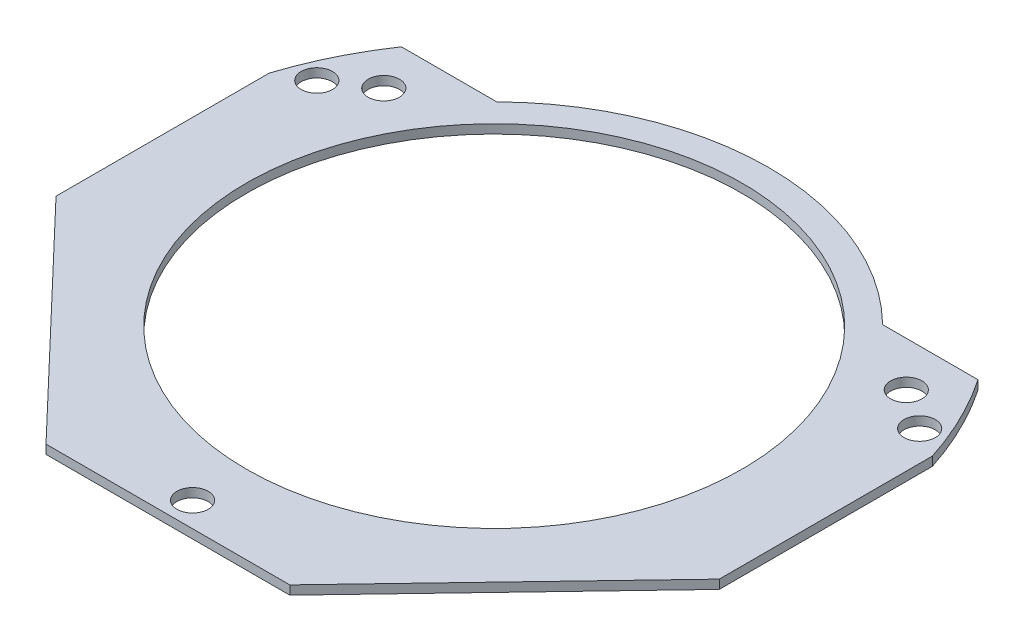
ISO-10303-21;
HEADER;
FILE_DESCRIPTION(('STEP AP214'),'2;1');
FILE_NAME('part.step','',(''),(''),'','','');
FILE_SCHEMA(('AUTOMOTIVE_DESIGN { 1 0 10303 214 1 1 1 1 }'));
ENDSEC;
DATA;
#1=APPLICATION_CONTEXT('core data for automotive mechanical design processes');
#2=APPLICATION_PROTOCOL_DEFINITION('international standard','automotive_design',2000,#1);
#3=PRODUCT_CONTEXT('',#1,'mechanical');
#4=PRODUCT('Part','Part','',(#3));
#5=PRODUCT_RELATED_PRODUCT_CATEGORY('part','',(#4));
#6=PRODUCT_DEFINITION_FORMATION('','',#4);
#7=PRODUCT_DEFINITION_CONTEXT('part definition',#1,'design');
#8=PRODUCT_DEFINITION('design','',#6,#7);
#9=PRODUCT_DEFINITION_SHAPE('','',#8);
#10=(LENGTH_UNIT() NAMED_UNIT(*) SI_UNIT(.MILLI.,.METRE.));
#11=(NAMED_UNIT(*) PLANE_ANGLE_UNIT() SI_UNIT($,.RADIAN.));
#12=(NAMED_UNIT(*) SI_UNIT($,.STERADIAN.) SOLID_ANGLE_UNIT());
#13=UNCERTAINTY_MEASURE_WITH_UNIT(LENGTH_MEASURE(1.E-05),#10,'distance_accuracy_value','');
#14=(GEOMETRIC_REPRESENTATION_CONTEXT(3) GLOBAL_UNCERTAINTY_ASSIGNED_CONTEXT((#13)) GLOBAL_UNIT_ASSIGNED_CONTEXT((#10,
#11,#12)) REPRESENTATION_CONTEXT('',''));
#15=CARTESIAN_POINT('',(0.,0.,0.));
#16=DIRECTION('',(0.,0.,1.));
#17=DIRECTION('',(1.,0.,0.));
#18=AXIS2_PLACEMENT_3D('',#15,#16,#17);
#19=CARTESIAN_POINT('',(0.,1.,0.));
#20=DIRECTION('',(0.,-1.,0.));
#21=DIRECTION('',(0.,0.,-1.));
#22=AXIS2_PLACEMENT_3D('',#19,#20,#21);
#23=CYLINDRICAL_SURFACE('',#22,39.);
#24=CARTESIAN_POINT('',(0.,1.,0.));
#25=DIRECTION('',(0.,1.,0.));
#26=DIRECTION('',(0.,0.,1.));
#27=AXIS2_PLACEMENT_3D('',#24,#25,#26);
#28=CIRCLE('',#27,39.);
#29=CARTESIAN_POINT('',(37.1302295401054,1.,-11.9308865680252));
#30=VERTEX_POINT('',#29);
#31=CARTESIAN_POINT('',(32.2790573942616,1.,-21.8874953737965));
#32=VERTEX_POINT('',#31);
#33=EDGE_CURVE('E221',#30,#32,#28,.T.);
#34=ORIENTED_EDGE('',*,*,#33,.F.);
#35=DIRECTION('',(0.,-1.,0.));
#36=VECTOR('',#35,1.);
#37=CARTESIAN_POINT('',(37.1302295401054,1.,-11.9308865680252));
#38=LINE('',#37,#36);
#39=CARTESIAN_POINT('',(37.1302295401054,0.,-11.9308865680252));
#40=VERTEX_POINT('',#39);
#41=EDGE_CURVE('E151',#30,#40,#38,.T.);
#42=ORIENTED_EDGE('',*,*,#41,.T.);
#43=CARTESIAN_POINT('',(0.,0.,0.));
#44=DIRECTION('',(0.,1.,0.));
#45=DIRECTION('',(0.,0.,1.));
#46=AXIS2_PLACEMENT_3D('',#43,#44,#45);
#47=CIRCLE('',#46,39.);
#48=CARTESIAN_POINT('',(32.2790573942616,0.,-21.8874953737965));
#49=VERTEX_POINT('',#48);
#50=EDGE_CURVE('E215',#40,#49,#47,.T.);
#51=ORIENTED_EDGE('',*,*,#50,.T.);
#52=DIRECTION('',(0.,-1.,0.));
#53=VECTOR('',#52,1.);
#54=CARTESIAN_POINT('',(32.2790573942616,1.,-21.8874953737965));
#55=LINE('',#54,#53);
#56=EDGE_CURVE('E178',#49,#32,#55,.F.);
#57=ORIENTED_EDGE('',*,*,#56,.T.);
#58=EDGE_LOOP('',(#34,#42,#51,#57));
#59=FACE_BOUND('',#58,.T.);
#60=ADVANCED_FACE('F35',(#59),#23,.T.);
#61=CARTESIAN_POINT('',(-32.2790573942616,0.,-21.8874953737965));
#62=VERTEX_POINT('',#61);
#63=CARTESIAN_POINT('',(-37.1302295401054,0.,-11.9308865680252));
#64=VERTEX_POINT('',#63);
#65=EDGE_CURVE('E222',#62,#64,#47,.T.);
#66=ORIENTED_EDGE('',*,*,#65,.T.);
#67=DIRECTION('',(0.,-1.,0.));
#68=VECTOR('',#67,1.);
#69=CARTESIAN_POINT('',(-37.1302295401054,1.,-11.9308865680252));
#70=LINE('',#69,#68);
#71=CARTESIAN_POINT('',(-37.1302295401054,1.,-11.9308865680252));
#72=VERTEX_POINT('',#71);
#73=EDGE_CURVE('E156',#64,#72,#70,.F.);
#74=ORIENTED_EDGE('',*,*,#73,.T.);
#75=CARTESIAN_POINT('',(-32.2790573942616,1.,-21.8874953737965));
#76=VERTEX_POINT('',#75);
#77=EDGE_CURVE('E218',#76,#72,#28,.T.);
#78=ORIENTED_EDGE('',*,*,#77,.F.);
#79=DIRECTION('',(0.,-1.,0.));
#80=VECTOR('',#79,1.);
#81=CARTESIAN_POINT('',(-32.2790573942616,1.,-21.8874953737965));
#82=LINE('',#81,#80);
#83=EDGE_CURVE('E174',#76,#62,#82,.T.);
#84=ORIENTED_EDGE('',*,*,#83,.T.);
#85=EDGE_LOOP('',(#66,#74,#78,#84));
#86=FACE_BOUND('',#85,.T.);
#87=ADVANCED_FACE('F37',(#86),#23,.T.);
#88=CARTESIAN_POINT('',(0.,1.,0.));
#89=DIRECTION('',(0.,1.,0.));
#90=DIRECTION('',(0.,0.,1.));
#91=AXIS2_PLACEMENT_3D('',#88,#89,#90);
#92=PLANE('',#91);
#93=DIRECTION('',(0.,0.,-1.));
#94=VECTOR('',#93,1.);
#95=CARTESIAN_POINT('',(-37.1302295401054,1.,11.9308865680252));
#96=LINE('',#95,#94);
#97=CARTESIAN_POINT('',(-37.1302295401054,1.,11.9308865680252));
#98=VERTEX_POINT('',#97);
#99=EDGE_CURVE('E133',#98,#72,#96,.T.);
#100=ORIENTED_EDGE('',*,*,#99,.F.);
#101=DIRECTION('',(-0.690409675030763,0.,-0.723418606771982));
#102=VECTOR('',#101,1.);
#103=CARTESIAN_POINT('',(-13.650716041934,1.,36.532970746197));
#104=LINE('',#103,#102);
#105=CARTESIAN_POINT('',(-13.650716041934,1.,36.532970746197));
#106=VERTEX_POINT('',#105);
#107=EDGE_CURVE('E135',#106,#98,#104,.T.);
#108=ORIENTED_EDGE('',*,*,#107,.F.);
#109=DIRECTION('',(-1.,0.,0.));
#110=VECTOR('',#109,1.);
#111=CARTESIAN_POINT('',(13.650716041934,1.,36.532970746197));
#112=LINE('',#111,#110);
#113=CARTESIAN_POINT('',(13.650716041934,1.,36.532970746197));
#114=VERTEX_POINT('',#113);
#115=EDGE_CURVE('E145',#114,#106,#112,.T.);
#116=ORIENTED_EDGE('',*,*,#115,.F.);
#117=DIRECTION('',(-0.690409675030763,0.,0.723418606771982));
#118=VECTOR('',#117,1.);
#119=CARTESIAN_POINT('',(37.1302295401054,1.,11.9308865680252));
#120=LINE('',#119,#118);
#121=CARTESIAN_POINT('',(37.1302295401054,1.,11.9308865680252));
#122=VERTEX_POINT('',#121);
#123=EDGE_CURVE('E116',#122,#114,#120,.T.);
#124=ORIENTED_EDGE('',*,*,#123,.F.);
#125=DIRECTION('',(0.,0.,1.));
#126=VECTOR('',#125,1.);
#127=CARTESIAN_POINT('',(37.1302295401054,1.,-19.9611219644377));
#128=LINE('',#127,#126);
#129=EDGE_CURVE('E142',#30,#122,#128,.T.);
#130=ORIENTED_EDGE('',*,*,#129,.F.);
#131=ORIENTED_EDGE('',*,*,#33,.T.);
#132=DIRECTION('',(1.,0.,0.));
#133=VECTOR('',#132,1.);
#134=CARTESIAN_POINT('',(21.5986121374045,1.,-21.8874953737965));
#135=LINE('',#134,#133);
#136=CARTESIAN_POINT('',(21.5986121374045,1.,-21.8874953737965));
#137=VERTEX_POINT('',#136);
#138=EDGE_CURVE('E162',#137,#32,#135,.T.);
#139=ORIENTED_EDGE('',*,*,#138,.F.);
#140=CARTESIAN_POINT('',(0.,1.,0.));
#141=DIRECTION('',(0.,-1.,0.));
#142=DIRECTION('',(0.,0.,1.));
#143=AXIS2_PLACEMENT_3D('',#140,#141,#142);
#144=CIRCLE('',#143,30.75);
#145=CARTESIAN_POINT('',(-21.5986121374045,1.,-21.8874953737965));
#146=VERTEX_POINT('',#145);
#147=EDGE_CURVE('E167',#146,#137,#144,.T.);
#148=ORIENTED_EDGE('',*,*,#147,.F.);
#149=DIRECTION('',(1.,0.,0.));
#150=VECTOR('',#149,1.);
#151=CARTESIAN_POINT('',(-41.1652741562572,1.,-21.8874953737965));
#152=LINE('',#151,#150);
#153=EDGE_CURVE('E159',#76,#146,#152,.T.);
#154=ORIENTED_EDGE('',*,*,#153,.F.);
#155=ORIENTED_EDGE('',*,*,#77,.T.);
#156=EDGE_LOOP('',(#100,#108,#116,#124,#130,#131,#139,#148,#154,#155));
#157=FACE_BOUND('',#156,.T.);
#158=CARTESIAN_POINT('',(-33.7500000000001,1.,-13.8874953737965));
#159=DIRECTION('',(0.,1.,0.));
#160=DIRECTION('',(0.,0.,-1.));
#161=AXIS2_PLACEMENT_3D('',#158,#159,#160);
#162=CIRCLE('',#161,1.75);
#163=CARTESIAN_POINT('',(-33.7500000000001,1.,-15.6374953737965));
#164=VERTEX_POINT('',#163);
#165=EDGE_CURVE('E181',#164,#164,#162,.T.);
#166=ORIENTED_EDGE('',*,*,#165,.F.);
#167=EDGE_LOOP('',(#166));
#168=FACE_BOUND('',#167,.T.);
#169=CARTESIAN_POINT('',(33.7500000000001,1.,-13.8874953737965));
#170=DIRECTION('',(0.,1.,0.));
#171=DIRECTION('',(0.,0.,1.));
#172=AXIS2_PLACEMENT_3D('',#169,#170,#171);
#173=CIRCLE('',#172,1.75);
#174=CARTESIAN_POINT('',(33.7500000000001,1.,-12.1374953737965));
#175=VERTEX_POINT('',#174);
#176=EDGE_CURVE('E185',#175,#175,#173,.T.);
#177=ORIENTED_EDGE('',*,*,#176,.F.);
#178=EDGE_LOOP('',(#177));
#179=FACE_BOUND('',#178,.T.);
#180=CARTESIAN_POINT('',(0.,1.,0.));
#181=DIRECTION('',(0.,1.,0.));
#182=DIRECTION('',(0.,0.,1.));
#183=AXIS2_PLACEMENT_3D('',#180,#181,#182);
#184=CIRCLE('',#183,27.75);
#185=CARTESIAN_POINT('',(0.,1.,27.75));
#186=VERTEX_POINT('',#185);
#187=EDGE_CURVE('E191',#186,#186,#184,.T.);
#188=ORIENTED_EDGE('',*,*,#187,.F.);
#189=EDGE_LOOP('',(#188));
#190=FACE_BOUND('',#189,.T.);
#191=CARTESIAN_POINT('',(0.,1.,33.7749907475931));
#192=DIRECTION('',(0.,1.,0.));
#193=DIRECTION('',(0.,0.,1.));
#194=AXIS2_PLACEMENT_3D('',#191,#192,#193);
#195=CIRCLE('',#194,1.75);
#196=CARTESIAN_POINT('',(0.,1.,35.5249907475931));
#197=VERTEX_POINT('',#196);
#198=EDGE_CURVE('E197',#197,#197,#195,.T.);
#199=ORIENTED_EDGE('',*,*,#198,.F.);
#200=EDGE_LOOP('',(#199));
#201=FACE_BOUND('',#200,.T.);
#202=CARTESIAN_POINT('',(-29.2499999999999,1.,-16.8874953737967));
#203=DIRECTION('',(0.,1.,0.));
#204=DIRECTION('',(0.,0.,1.));
#205=AXIS2_PLACEMENT_3D('',#202,#203,#204);
#206=CIRCLE('',#205,1.75);
#207=CARTESIAN_POINT('',(-29.2499999999999,1.,-15.1374953737967));
#208=VERTEX_POINT('',#207);
#209=EDGE_CURVE('E203',#208,#208,#206,.T.);
#210=ORIENTED_EDGE('',*,*,#209,.F.);
#211=EDGE_LOOP('',(#210));
#212=FACE_BOUND('',#211,.T.);
#213=CARTESIAN_POINT('',(29.2500000000001,1.,-16.8874953737965));
#214=DIRECTION('',(0.,1.,0.));
#215=DIRECTION('',(0.,0.,1.));
#216=AXIS2_PLACEMENT_3D('',#213,#214,#215);
#217=CIRCLE('',#216,1.75);
#218=CARTESIAN_POINT('',(29.2500000000001,1.,-15.1374953737965));
#219=VERTEX_POINT('',#218);
#220=EDGE_CURVE('E209',#219,#219,#217,.T.);
#221=ORIENTED_EDGE('',*,*,#220,.F.);
#222=EDGE_LOOP('',(#221));
#223=FACE_BOUND('',#222,.T.);
#224=ADVANCED_FACE('F233',(#157,#168,#179,#190,#201,#212,#223),#92,.T.);
#225=CARTESIAN_POINT('',(0.,0.,0.));
#226=DIRECTION('',(0.,1.,0.));
#227=DIRECTION('',(0.,0.,1.));
#228=AXIS2_PLACEMENT_3D('',#225,#226,#227);
#229=PLANE('',#228);
#230=CARTESIAN_POINT('',(-33.7500000000001,0.,-13.8874953737965));
#231=DIRECTION('',(0.,1.,0.));
#232=DIRECTION('',(0.,0.,-1.));
#233=AXIS2_PLACEMENT_3D('',#230,#231,#232);
#234=CIRCLE('',#233,1.75);
#235=CARTESIAN_POINT('',(-33.7500000000001,0.,-15.6374953737965));
#236=VERTEX_POINT('',#235);
#237=EDGE_CURVE('E182',#236,#236,#234,.T.);
#238=ORIENTED_EDGE('',*,*,#237,.T.);
#239=EDGE_LOOP('',(#238));
#240=FACE_BOUND('',#239,.T.);
#241=CARTESIAN_POINT('',(33.7500000000001,0.,-13.8874953737965));
#242=DIRECTION('',(0.,1.,0.));
#243=DIRECTION('',(0.,0.,1.));
#244=AXIS2_PLACEMENT_3D('',#241,#242,#243);
#245=CIRCLE('',#244,1.75);
#246=CARTESIAN_POINT('',(33.7500000000001,0.,-12.1374953737965));
#247=VERTEX_POINT('',#246);
#248=EDGE_CURVE('E188',#247,#247,#245,.T.);
#249=ORIENTED_EDGE('',*,*,#248,.T.);
#250=EDGE_LOOP('',(#249));
#251=FACE_BOUND('',#250,.T.);
#252=CARTESIAN_POINT('',(0.,0.,0.));
#253=DIRECTION('',(0.,1.,0.));
#254=DIRECTION('',(0.,0.,1.));
#255=AXIS2_PLACEMENT_3D('',#252,#253,#254);
#256=CIRCLE('',#255,27.75);
#257=CARTESIAN_POINT('',(0.,0.,27.75));
#258=VERTEX_POINT('',#257);
#259=EDGE_CURVE('E194',#258,#258,#256,.T.);
#260=ORIENTED_EDGE('',*,*,#259,.T.);
#261=EDGE_LOOP('',(#260));
#262=FACE_BOUND('',#261,.T.);
#263=CARTESIAN_POINT('',(0.,0.,33.7749907475931));
#264=DIRECTION('',(0.,1.,0.));
#265=DIRECTION('',(0.,0.,1.));
#266=AXIS2_PLACEMENT_3D('',#263,#264,#265);
#267=CIRCLE('',#266,1.75);
#268=CARTESIAN_POINT('',(0.,0.,35.5249907475931));
#269=VERTEX_POINT('',#268);
#270=EDGE_CURVE('E200',#269,#269,#267,.T.);
#271=ORIENTED_EDGE('',*,*,#270,.T.);
#272=EDGE_LOOP('',(#271));
#273=FACE_BOUND('',#272,.T.);
#274=CARTESIAN_POINT('',(-29.2499999999999,0.,-16.8874953737967));
#275=DIRECTION('',(0.,1.,0.));
#276=DIRECTION('',(0.,0.,1.));
#277=AXIS2_PLACEMENT_3D('',#274,#275,#276);
#278=CIRCLE('',#277,1.75);
#279=CARTESIAN_POINT('',(-29.2499999999999,0.,-15.1374953737967));
#280=VERTEX_POINT('',#279);
#281=EDGE_CURVE('E206',#280,#280,#278,.T.);
#282=ORIENTED_EDGE('',*,*,#281,.T.);
#283=EDGE_LOOP('',(#282));
#284=FACE_BOUND('',#283,.T.);
#285=CARTESIAN_POINT('',(29.2500000000001,0.,-16.8874953737965));
#286=DIRECTION('',(0.,1.,0.));
#287=DIRECTION('',(0.,0.,1.));
#288=AXIS2_PLACEMENT_3D('',#285,#286,#287);
#289=CIRCLE('',#288,1.75);
#290=CARTESIAN_POINT('',(29.2500000000001,0.,-15.1374953737965));
#291=VERTEX_POINT('',#290);
#292=EDGE_CURVE('E212',#291,#291,#289,.T.);
#293=ORIENTED_EDGE('',*,*,#292,.T.);
#294=EDGE_LOOP('',(#293));
#295=FACE_BOUND('',#294,.T.);
#296=DIRECTION('',(-0.690409675030763,0.,-0.723418606771982));
#297=VECTOR('',#296,1.);
#298=CARTESIAN_POINT('',(-13.650716041934,0.,36.532970746197));
#299=LINE('',#298,#297);
#300=CARTESIAN_POINT('',(-13.650716041934,0.,36.532970746197));
#301=VERTEX_POINT('',#300);
#302=CARTESIAN_POINT('',(-37.1302295401054,0.,11.9308865680252));
#303=VERTEX_POINT('',#302);
#304=EDGE_CURVE('E129',#301,#303,#299,.T.);
#305=ORIENTED_EDGE('',*,*,#304,.T.);
#306=DIRECTION('',(0.,0.,-1.));
#307=VECTOR('',#306,1.);
#308=CARTESIAN_POINT('',(-37.1302295401054,0.,11.9308865680252));
#309=LINE('',#308,#307);
#310=EDGE_CURVE('E139',#303,#64,#309,.T.);
#311=ORIENTED_EDGE('',*,*,#310,.T.);
#312=ORIENTED_EDGE('',*,*,#65,.F.);
#313=DIRECTION('',(1.,0.,0.));
#314=VECTOR('',#313,1.);
#315=CARTESIAN_POINT('',(0.,0.,-21.8874953737965));
#316=LINE('',#315,#314);
#317=CARTESIAN_POINT('',(-21.5986121374045,0.,-21.8874953737965));
#318=VERTEX_POINT('',#317);
#319=EDGE_CURVE('E43',#62,#318,#316,.T.);
#320=ORIENTED_EDGE('',*,*,#319,.T.);
#321=CARTESIAN_POINT('',(0.,0.,0.));
#322=DIRECTION('',(0.,-1.,0.));
#323=DIRECTION('',(0.,0.,1.));
#324=AXIS2_PLACEMENT_3D('',#321,#322,#323);
#325=CIRCLE('',#324,30.75);
#326=CARTESIAN_POINT('',(21.5986121374045,0.,-21.8874953737965));
#327=VERTEX_POINT('',#326);
#328=EDGE_CURVE('E58',#318,#327,#325,.T.);
#329=ORIENTED_EDGE('',*,*,#328,.T.);
#330=DIRECTION('',(1.,0.,0.));
#331=VECTOR('',#330,1.);
#332=CARTESIAN_POINT('',(21.5986121374045,0.,-21.8874953737965));
#333=LINE('',#332,#331);
#334=EDGE_CURVE('E161',#327,#49,#333,.T.);
#335=ORIENTED_EDGE('',*,*,#334,.T.);
#336=ORIENTED_EDGE('',*,*,#50,.F.);
#337=DIRECTION('',(0.,0.,1.));
#338=VECTOR('',#337,1.);
#339=CARTESIAN_POINT('',(37.1302295401054,0.,0.));
#340=LINE('',#339,#338);
#341=CARTESIAN_POINT('',(37.1302295401054,0.,11.9308865680252));
#342=VERTEX_POINT('',#341);
#343=EDGE_CURVE('E11',#40,#342,#340,.T.);
#344=ORIENTED_EDGE('',*,*,#343,.T.);
#345=DIRECTION('',(-0.690409675030763,0.,0.723418606771982));
#346=VECTOR('',#345,1.);
#347=CARTESIAN_POINT('',(37.1302295401054,0.,11.9308865680252));
#348=LINE('',#347,#346);
#349=CARTESIAN_POINT('',(13.650716041934,0.,36.532970746197));
#350=VERTEX_POINT('',#349);
#351=EDGE_CURVE('E50',#342,#350,#348,.T.);
#352=ORIENTED_EDGE('',*,*,#351,.T.);
#353=DIRECTION('',(-1.,0.,0.));
#354=VECTOR('',#353,1.);
#355=CARTESIAN_POINT('',(13.650716041934,0.,36.532970746197));
#356=LINE('',#355,#354);
#357=EDGE_CURVE('E124',#350,#301,#356,.T.);
#358=ORIENTED_EDGE('',*,*,#357,.T.);
#359=EDGE_LOOP('',(#305,#311,#312,#320,#329,#335,#336,#344,#352,#358));
#360=FACE_BOUND('',#359,.T.);
#361=ADVANCED_FACE('F131',(#240,#251,#262,#273,#284,#295,#360),#229,.F.);
#362=CARTESIAN_POINT('',(29.2500000000001,0.,-16.8874953737965));
#363=DIRECTION('',(0.,1.,0.));
#364=DIRECTION('',(0.,0.,1.));
#365=AXIS2_PLACEMENT_3D('',#362,#363,#364);
#366=CYLINDRICAL_SURFACE('',#365,1.75);
#367=ORIENTED_EDGE('',*,*,#292,.F.);
#368=EDGE_LOOP('',(#367));
#369=FACE_BOUND('',#368,.T.);
#370=ORIENTED_EDGE('',*,*,#220,.T.);
#371=EDGE_LOOP('',(#370));
#372=FACE_BOUND('',#371,.T.);
#373=ADVANCED_FACE('F273',(#369,#372),#366,.F.);
#374=CARTESIAN_POINT('',(-29.2499999999999,0.,-16.8874953737967));
#375=DIRECTION('',(0.,1.,0.));
#376=DIRECTION('',(0.,0.,1.));
#377=AXIS2_PLACEMENT_3D('',#374,#375,#376);
#378=CYLINDRICAL_SURFACE('',#377,1.75);
#379=ORIENTED_EDGE('',*,*,#281,.F.);
#380=EDGE_LOOP('',(#379));
#381=FACE_BOUND('',#380,.T.);
#382=ORIENTED_EDGE('',*,*,#209,.T.);
#383=EDGE_LOOP('',(#382));
#384=FACE_BOUND('',#383,.T.);
#385=ADVANCED_FACE('F278',(#381,#384),#378,.F.);
#386=CARTESIAN_POINT('',(0.,0.,33.7749907475931));
#387=DIRECTION('',(0.,1.,0.));
#388=DIRECTION('',(0.,0.,1.));
#389=AXIS2_PLACEMENT_3D('',#386,#387,#388);
#390=CYLINDRICAL_SURFACE('',#389,1.75);
#391=ORIENTED_EDGE('',*,*,#270,.F.);
#392=EDGE_LOOP('',(#391));
#393=FACE_BOUND('',#392,.T.);
#394=ORIENTED_EDGE('',*,*,#198,.T.);
#395=EDGE_LOOP('',(#394));
#396=FACE_BOUND('',#395,.T.);
#397=ADVANCED_FACE('F282',(#393,#396),#390,.F.);
#398=CARTESIAN_POINT('',(0.,0.,0.));
#399=DIRECTION('',(0.,1.,0.));
#400=DIRECTION('',(0.,0.,1.));
#401=AXIS2_PLACEMENT_3D('',#398,#399,#400);
#402=CYLINDRICAL_SURFACE('',#401,27.75);
#403=ORIENTED_EDGE('',*,*,#259,.F.);
#404=EDGE_LOOP('',(#403));
#405=FACE_BOUND('',#404,.T.);
#406=ORIENTED_EDGE('',*,*,#187,.T.);
#407=EDGE_LOOP('',(#406));
#408=FACE_BOUND('',#407,.T.);
#409=ADVANCED_FACE('F286',(#405,#408),#402,.F.);
#410=CARTESIAN_POINT('',(33.7500000000001,0.,-13.8874953737965));
#411=DIRECTION('',(0.,1.,0.));
#412=DIRECTION('',(0.,0.,1.));
#413=AXIS2_PLACEMENT_3D('',#410,#411,#412);
#414=CYLINDRICAL_SURFACE('',#413,1.75);
#415=ORIENTED_EDGE('',*,*,#248,.F.);
#416=EDGE_LOOP('',(#415));
#417=FACE_BOUND('',#416,.T.);
#418=ORIENTED_EDGE('',*,*,#176,.T.);
#419=EDGE_LOOP('',(#418));
#420=FACE_BOUND('',#419,.T.);
#421=ADVANCED_FACE('F290',(#417,#420),#414,.F.);
#422=CARTESIAN_POINT('',(-33.7500000000001,0.,-13.8874953737965));
#423=DIRECTION('',(0.,1.,0.));
#424=DIRECTION('',(0.,0.,1.));
#425=AXIS2_PLACEMENT_3D('',#422,#423,#424);
#426=CYLINDRICAL_SURFACE('',#425,1.75);
#427=ORIENTED_EDGE('',*,*,#237,.F.);
#428=EDGE_LOOP('',(#427));
#429=FACE_BOUND('',#428,.T.);
#430=ORIENTED_EDGE('',*,*,#165,.T.);
#431=EDGE_LOOP('',(#430));
#432=FACE_BOUND('',#431,.T.);
#433=ADVANCED_FACE('F294',(#429,#432),#426,.F.);
#434=CARTESIAN_POINT('',(21.5986121374045,0.,-21.8874953737965));
#435=DIRECTION('',(0.,0.,1.));
#436=DIRECTION('',(1.,0.,0.));
#437=AXIS2_PLACEMENT_3D('',#434,#435,#436);
#438=PLANE('',#437);
#439=ORIENTED_EDGE('',*,*,#334,.F.);
#440=DIRECTION('',(0.,1.,0.));
#441=VECTOR('',#440,1.);
#442=CARTESIAN_POINT('',(21.5986121374045,0.,-21.8874953737965));
#443=LINE('',#442,#441);
#444=EDGE_CURVE('E172',#327,#137,#443,.T.);
#445=ORIENTED_EDGE('',*,*,#444,.T.);
#446=ORIENTED_EDGE('',*,*,#138,.T.);
#447=ORIENTED_EDGE('',*,*,#56,.F.);
#448=EDGE_LOOP('',(#439,#445,#446,#447));
#449=FACE_BOUND('',#448,.T.);
#450=ADVANCED_FACE('F244',(#449),#438,.F.);
#451=CARTESIAN_POINT('',(-41.1652741562572,0.,-21.8874953737965));
#452=DIRECTION('',(0.,0.,1.));
#453=DIRECTION('',(1.,0.,0.));
#454=AXIS2_PLACEMENT_3D('',#451,#452,#453);
#455=PLANE('',#454);
#456=ORIENTED_EDGE('',*,*,#153,.T.);
#457=DIRECTION('',(0.,1.,0.));
#458=VECTOR('',#457,1.);
#459=CARTESIAN_POINT('',(-21.5986121374045,0.,-21.8874953737965));
#460=LINE('',#459,#458);
#461=EDGE_CURVE('E165',#318,#146,#460,.T.);
#462=ORIENTED_EDGE('',*,*,#461,.F.);
#463=ORIENTED_EDGE('',*,*,#319,.F.);
#464=ORIENTED_EDGE('',*,*,#83,.F.);
#465=EDGE_LOOP('',(#456,#462,#463,#464));
#466=FACE_BOUND('',#465,.T.);
#467=ADVANCED_FACE('F227',(#466),#455,.F.);
#468=CARTESIAN_POINT('',(0.,0.,0.));
#469=DIRECTION('',(0.,1.,0.));
#470=DIRECTION('',(0.,0.,1.));
#471=AXIS2_PLACEMENT_3D('',#468,#469,#470);
#472=CYLINDRICAL_SURFACE('',#471,30.75);
#473=ORIENTED_EDGE('',*,*,#147,.T.);
#474=ORIENTED_EDGE('',*,*,#444,.F.);
#475=ORIENTED_EDGE('',*,*,#328,.F.);
#476=ORIENTED_EDGE('',*,*,#461,.T.);
#477=EDGE_LOOP('',(#473,#474,#475,#476));
#478=FACE_BOUND('',#477,.T.);
#479=ADVANCED_FACE('F238',(#478),#472,.T.);
#480=CARTESIAN_POINT('',(-37.1302295401054,0.,11.9308865680252));
#481=DIRECTION('',(1.,0.,0.));
#482=DIRECTION('',(0.,0.,-1.));
#483=AXIS2_PLACEMENT_3D('',#480,#481,#482);
#484=PLANE('',#483);
#485=ORIENTED_EDGE('',*,*,#310,.F.);
#486=DIRECTION('',(0.,1.,0.));
#487=VECTOR('',#486,1.);
#488=CARTESIAN_POINT('',(-37.1302295401054,0.,11.9308865680252));
#489=LINE('',#488,#487);
#490=EDGE_CURVE('E149',#303,#98,#489,.T.);
#491=ORIENTED_EDGE('',*,*,#490,.T.);
#492=ORIENTED_EDGE('',*,*,#99,.T.);
#493=ORIENTED_EDGE('',*,*,#73,.F.);
#494=EDGE_LOOP('',(#485,#491,#492,#493));
#495=FACE_BOUND('',#494,.T.);
#496=ADVANCED_FACE('F252',(#495),#484,.F.);
#497=CARTESIAN_POINT('',(37.1302295401054,0.,-19.9611219644377));
#498=DIRECTION('',(-1.,0.,0.));
#499=DIRECTION('',(0.,0.,1.));
#500=AXIS2_PLACEMENT_3D('',#497,#498,#499);
#501=PLANE('',#500);
#502=ORIENTED_EDGE('',*,*,#129,.T.);
#503=DIRECTION('',(0.,1.,0.));
#504=VECTOR('',#503,1.);
#505=CARTESIAN_POINT('',(37.1302295401054,0.,11.9308865680252));
#506=LINE('',#505,#504);
#507=EDGE_CURVE('E121',#342,#122,#506,.T.);
#508=ORIENTED_EDGE('',*,*,#507,.F.);
#509=ORIENTED_EDGE('',*,*,#343,.F.);
#510=ORIENTED_EDGE('',*,*,#41,.F.);
#511=EDGE_LOOP('',(#502,#508,#509,#510));
#512=FACE_BOUND('',#511,.T.);
#513=ADVANCED_FACE('F247',(#512),#501,.F.);
#514=CARTESIAN_POINT('',(-13.650716041934,0.,36.532970746197));
#515=DIRECTION('',(0.723418606771982,0.,-0.690409675030763));
#516=DIRECTION('',(-0.690409675030763,0.,-0.723418606771982));
#517=AXIS2_PLACEMENT_3D('',#514,#515,#516);
#518=PLANE('',#517);
#519=ORIENTED_EDGE('',*,*,#107,.T.);
#520=ORIENTED_EDGE('',*,*,#490,.F.);
#521=ORIENTED_EDGE('',*,*,#304,.F.);
#522=DIRECTION('',(0.,1.,0.));
#523=VECTOR('',#522,1.);
#524=CARTESIAN_POINT('',(-13.650716041934,0.,36.532970746197));
#525=LINE('',#524,#523);
#526=EDGE_CURVE('E120',#301,#106,#525,.T.);
#527=ORIENTED_EDGE('',*,*,#526,.T.);
#528=EDGE_LOOP('',(#519,#520,#521,#527));
#529=FACE_BOUND('',#528,.T.);
#530=ADVANCED_FACE('F249',(#529),#518,.F.);
#531=CARTESIAN_POINT('',(13.650716041934,0.,36.532970746197));
#532=DIRECTION('',(0.,0.,-1.));
#533=DIRECTION('',(-1.,0.,0.));
#534=AXIS2_PLACEMENT_3D('',#531,#532,#533);
#535=PLANE('',#534);
#536=ORIENTED_EDGE('',*,*,#115,.T.);
#537=ORIENTED_EDGE('',*,*,#526,.F.);
#538=ORIENTED_EDGE('',*,*,#357,.F.);
#539=DIRECTION('',(0.,1.,0.));
#540=VECTOR('',#539,1.);
#541=CARTESIAN_POINT('',(13.650716041934,0.,36.532970746197));
#542=LINE('',#541,#540);
#543=EDGE_CURVE('E112',#350,#114,#542,.T.);
#544=ORIENTED_EDGE('',*,*,#543,.T.);
#545=EDGE_LOOP('',(#536,#537,#538,#544));
#546=FACE_BOUND('',#545,.T.);
#547=ADVANCED_FACE('F125',(#546),#535,.F.);
#548=CARTESIAN_POINT('',(37.1302295401054,0.,11.9308865680252));
#549=DIRECTION('',(-0.723418606771982,0.,-0.690409675030763));
#550=DIRECTION('',(-0.690409675030763,0.,0.723418606771982));
#551=AXIS2_PLACEMENT_3D('',#548,#549,#550);
#552=PLANE('',#551);
#553=ORIENTED_EDGE('',*,*,#123,.T.);
#554=ORIENTED_EDGE('',*,*,#543,.F.);
#555=ORIENTED_EDGE('',*,*,#351,.F.);
#556=ORIENTED_EDGE('',*,*,#507,.T.);
#557=EDGE_LOOP('',(#553,#554,#555,#556));
#558=FACE_BOUND('',#557,.T.);
#559=ADVANCED_FACE('F114',(#558),#552,.F.);
#560=CLOSED_SHELL('',(#60,#87,#224,#361,#373,#385,#397,#409,#421,#433,#450,#467,#479,#496,#513,
#530,#547,#559));
#561=MANIFOLD_SOLID_BREP('B2',#560);
#562=ADVANCED_BREP_SHAPE_REPRESENTATION('',(#18,#561),#14);
#563=SHAPE_DEFINITION_REPRESENTATION(#9,#562);
ENDSEC;
END-ISO-10303-21;
